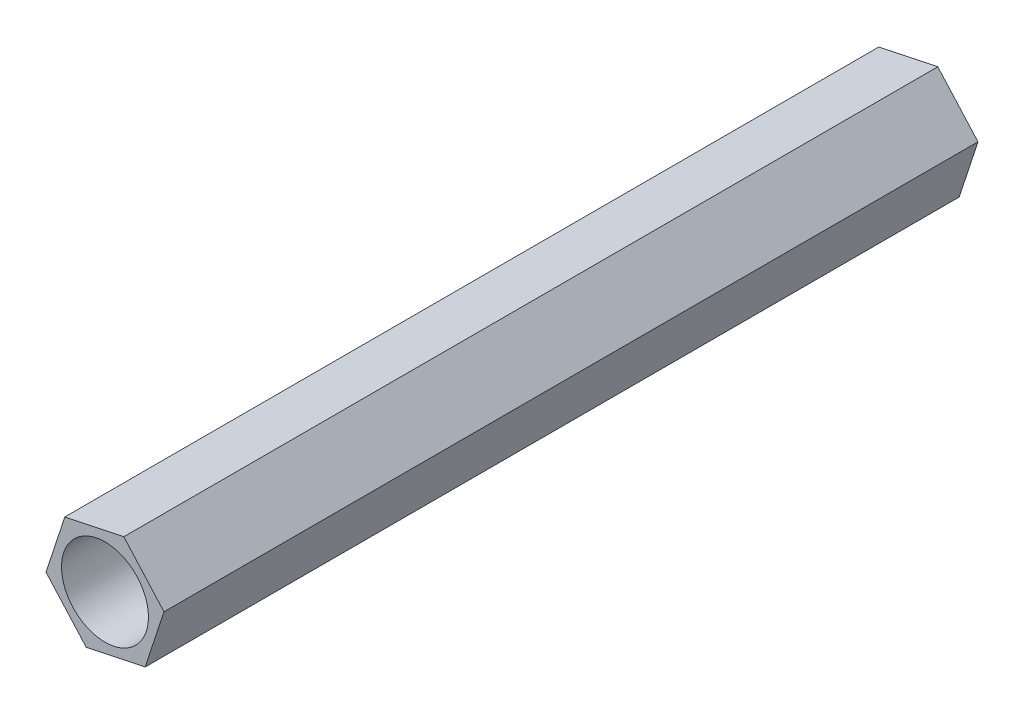
ISO-10303-21;
HEADER;
FILE_DESCRIPTION(('STEP AP214'),'2;1');
FILE_NAME('part.step','',(''),(''),'','','');
FILE_SCHEMA(('AUTOMOTIVE_DESIGN { 1 0 10303 214 1 1 1 1 }'));
ENDSEC;
DATA;
#1=APPLICATION_CONTEXT('core data for automotive mechanical design processes');
#2=APPLICATION_PROTOCOL_DEFINITION('international standard','automotive_design',2000,#1);
#3=PRODUCT_CONTEXT('',#1,'mechanical');
#4=PRODUCT('Part','Part','',(#3));
#5=PRODUCT_RELATED_PRODUCT_CATEGORY('part','',(#4));
#6=PRODUCT_DEFINITION_FORMATION('','',#4);
#7=PRODUCT_DEFINITION_CONTEXT('part definition',#1,'design');
#8=PRODUCT_DEFINITION('design','',#6,#7);
#9=PRODUCT_DEFINITION_SHAPE('','',#8);
#10=(LENGTH_UNIT() NAMED_UNIT(*) SI_UNIT(.MILLI.,.METRE.));
#11=(NAMED_UNIT(*) PLANE_ANGLE_UNIT() SI_UNIT($,.RADIAN.));
#12=(NAMED_UNIT(*) SI_UNIT($,.STERADIAN.) SOLID_ANGLE_UNIT());
#13=UNCERTAINTY_MEASURE_WITH_UNIT(LENGTH_MEASURE(1.E-05),#10,'distance_accuracy_value','');
#14=(GEOMETRIC_REPRESENTATION_CONTEXT(3) GLOBAL_UNCERTAINTY_ASSIGNED_CONTEXT((#13)) GLOBAL_UNIT_ASSIGNED_CONTEXT((#10,
#11,#12)) REPRESENTATION_CONTEXT('',''));
#15=CARTESIAN_POINT('',(0.,0.,0.));
#16=DIRECTION('',(0.,0.,1.));
#17=DIRECTION('',(1.,0.,0.));
#18=AXIS2_PLACEMENT_3D('',#15,#16,#17);
#19=CARTESIAN_POINT('',(2.30919726239614,-2.58217118010061,46.8));
#20=DIRECTION('',(-0.95000362208023,0.312238879761064,0.));
#21=DIRECTION('',(-0.312238879761064,-0.95000362208023,0.));
#22=AXIS2_PLACEMENT_3D('',#19,#20,#21);
#23=PLANE('',#22);
#24=DIRECTION('',(0.312238879761064,0.95000362208023,0.));
#25=VECTOR('',#24,1.);
#26=CARTESIAN_POINT('',(2.30919726239614,-2.58217118010061,0.));
#27=LINE('',#26,#25);
#28=CARTESIAN_POINT('',(2.30919726239614,-2.58217118010061,0.));
#29=VERTEX_POINT('',#28);
#30=CARTESIAN_POINT('',(3.39082447008525,0.708737901534229,0.));
#31=VERTEX_POINT('',#30);
#32=EDGE_CURVE('E118',#29,#31,#27,.T.);
#33=ORIENTED_EDGE('',*,*,#32,.T.);
#34=DIRECTION('',(0.,0.,-1.));
#35=VECTOR('',#34,1.);
#36=CARTESIAN_POINT('',(3.39082447008525,0.708737901534229,46.8));
#37=LINE('',#36,#35);
#38=CARTESIAN_POINT('',(3.39082447008525,0.708737901534229,46.8));
#39=VERTEX_POINT('',#38);
#40=EDGE_CURVE('E11',#39,#31,#37,.T.);
#41=ORIENTED_EDGE('',*,*,#40,.F.);
#42=DIRECTION('',(0.312238879761064,0.95000362208023,0.));
#43=VECTOR('',#42,1.);
#44=CARTESIAN_POINT('',(2.30919726239614,-2.58217118010061,46.8));
#45=LINE('',#44,#43);
#46=CARTESIAN_POINT('',(2.30919726239614,-2.58217118010061,46.8));
#47=VERTEX_POINT('',#46);
#48=EDGE_CURVE('E129',#47,#39,#45,.T.);
#49=ORIENTED_EDGE('',*,*,#48,.F.);
#50=DIRECTION('',(0.,0.,-1.));
#51=VECTOR('',#50,1.);
#52=CARTESIAN_POINT('',(2.30919726239614,-2.58217118010061,46.8));
#53=LINE('',#52,#51);
#54=EDGE_CURVE('E114',#47,#29,#53,.T.);
#55=ORIENTED_EDGE('',*,*,#54,.T.);
#56=EDGE_LOOP('',(#33,#41,#49,#55));
#57=FACE_BOUND('',#56,.T.);
#58=ADVANCED_FACE('F34',(#57),#23,.F.);
#59=CARTESIAN_POINT('',(3.39082447008525,0.708737901534229,46.8));
#60=DIRECTION('',(-0.745408612962391,-0.666607830528178,0.));
#61=DIRECTION('',(0.666607830528178,-0.745408612962391,0.));
#62=AXIS2_PLACEMENT_3D('',#59,#60,#61);
#63=PLANE('',#62);
#64=DIRECTION('',(-0.666607830528178,0.745408612962391,0.));
#65=VECTOR('',#64,1.);
#66=CARTESIAN_POINT('',(3.39082447008525,0.708737901534229,0.));
#67=LINE('',#66,#65);
#68=CARTESIAN_POINT('',(1.08162720768911,3.29090908163484,0.));
#69=VERTEX_POINT('',#68);
#70=EDGE_CURVE('E121',#31,#69,#67,.T.);
#71=ORIENTED_EDGE('',*,*,#70,.T.);
#72=DIRECTION('',(0.,0.,-1.));
#73=VECTOR('',#72,1.);
#74=CARTESIAN_POINT('',(1.08162720768911,3.29090908163484,46.8));
#75=LINE('',#74,#73);
#76=CARTESIAN_POINT('',(1.08162720768911,3.29090908163484,46.8));
#77=VERTEX_POINT('',#76);
#78=EDGE_CURVE('E42',#77,#69,#75,.T.);
#79=ORIENTED_EDGE('',*,*,#78,.F.);
#80=DIRECTION('',(-0.666607830528178,0.745408612962391,0.));
#81=VECTOR('',#80,1.);
#82=CARTESIAN_POINT('',(3.39082447008525,0.708737901534229,46.8));
#83=LINE('',#82,#81);
#84=EDGE_CURVE('E87',#39,#77,#83,.T.);
#85=ORIENTED_EDGE('',*,*,#84,.F.);
#86=ORIENTED_EDGE('',*,*,#40,.T.);
#87=EDGE_LOOP('',(#71,#79,#85,#86));
#88=FACE_BOUND('',#87,.T.);
#89=ADVANCED_FACE('F154',(#88),#63,.F.);
#90=CARTESIAN_POINT('',(1.08162720768911,3.29090908163484,46.8));
#91=DIRECTION('',(0.204595009117839,-0.978846710289242,0.));
#92=DIRECTION('',(0.978846710289242,0.204595009117839,0.));
#93=AXIS2_PLACEMENT_3D('',#90,#91,#92);
#94=PLANE('',#93);
#95=DIRECTION('',(-0.978846710289242,-0.204595009117839,0.));
#96=VECTOR('',#95,1.);
#97=CARTESIAN_POINT('',(1.08162720768911,3.29090908163484,0.));
#98=LINE('',#97,#96);
#99=CARTESIAN_POINT('',(-2.30919726239613,2.58217118010061,0.));
#100=VERTEX_POINT('',#99);
#101=EDGE_CURVE('E124',#69,#100,#98,.T.);
#102=ORIENTED_EDGE('',*,*,#101,.T.);
#103=DIRECTION('',(0.,0.,-1.));
#104=VECTOR('',#103,1.);
#105=CARTESIAN_POINT('',(-2.30919726239613,2.58217118010061,46.8));
#106=LINE('',#105,#104);
#107=CARTESIAN_POINT('',(-2.30919726239613,2.58217118010061,46.8));
#108=VERTEX_POINT('',#107);
#109=EDGE_CURVE('E109',#108,#100,#106,.T.);
#110=ORIENTED_EDGE('',*,*,#109,.F.);
#111=DIRECTION('',(-0.978846710289242,-0.204595009117839,0.));
#112=VECTOR('',#111,1.);
#113=CARTESIAN_POINT('',(1.08162720768911,3.29090908163484,46.8));
#114=LINE('',#113,#112);
#115=EDGE_CURVE('E100',#77,#108,#114,.T.);
#116=ORIENTED_EDGE('',*,*,#115,.F.);
#117=ORIENTED_EDGE('',*,*,#78,.T.);
#118=EDGE_LOOP('',(#102,#110,#116,#117));
#119=FACE_BOUND('',#118,.T.);
#120=ADVANCED_FACE('F135',(#119),#94,.F.);
#121=CARTESIAN_POINT('',(-2.30919726239613,2.58217118010061,46.8));
#122=DIRECTION('',(0.95000362208023,-0.312238879761064,0.));
#123=DIRECTION('',(0.312238879761064,0.95000362208023,0.));
#124=AXIS2_PLACEMENT_3D('',#121,#122,#123);
#125=PLANE('',#124);
#126=DIRECTION('',(-0.312238879761064,-0.95000362208023,0.));
#127=VECTOR('',#126,1.);
#128=CARTESIAN_POINT('',(-2.30919726239613,2.58217118010061,0.));
#129=LINE('',#128,#127);
#130=CARTESIAN_POINT('',(-3.39082447008524,-0.708737901534228,0.));
#131=VERTEX_POINT('',#130);
#132=EDGE_CURVE('E108',#100,#131,#129,.T.);
#133=ORIENTED_EDGE('',*,*,#132,.T.);
#134=DIRECTION('',(0.,0.,-1.));
#135=VECTOR('',#134,1.);
#136=CARTESIAN_POINT('',(-3.39082447008524,-0.708737901534228,46.8));
#137=LINE('',#136,#135);
#138=CARTESIAN_POINT('',(-3.39082447008524,-0.708737901534228,46.8));
#139=VERTEX_POINT('',#138);
#140=EDGE_CURVE('E105',#139,#131,#137,.T.);
#141=ORIENTED_EDGE('',*,*,#140,.F.);
#142=DIRECTION('',(-0.312238879761064,-0.95000362208023,0.));
#143=VECTOR('',#142,1.);
#144=CARTESIAN_POINT('',(-2.30919726239613,2.58217118010061,46.8));
#145=LINE('',#144,#143);
#146=EDGE_CURVE('E94',#108,#139,#145,.T.);
#147=ORIENTED_EDGE('',*,*,#146,.F.);
#148=ORIENTED_EDGE('',*,*,#109,.T.);
#149=EDGE_LOOP('',(#133,#141,#147,#148));
#150=FACE_BOUND('',#149,.T.);
#151=ADVANCED_FACE('F106',(#150),#125,.F.);
#152=CARTESIAN_POINT('',(-3.39082447008524,-0.708737901534228,46.8));
#153=DIRECTION('',(0.745408612962391,0.666607830528178,0.));
#154=DIRECTION('',(-0.666607830528179,0.745408612962391,0.));
#155=AXIS2_PLACEMENT_3D('',#152,#153,#154);
#156=PLANE('',#155);
#157=DIRECTION('',(0.666607830528179,-0.745408612962391,0.));
#158=VECTOR('',#157,1.);
#159=CARTESIAN_POINT('',(-3.39082447008524,-0.708737901534228,0.));
#160=LINE('',#159,#158);
#161=CARTESIAN_POINT('',(-1.0816272076891,-3.29090908163484,0.));
#162=VERTEX_POINT('',#161);
#163=EDGE_CURVE('E73',#131,#162,#160,.T.);
#164=ORIENTED_EDGE('',*,*,#163,.T.);
#165=DIRECTION('',(0.,0.,-1.));
#166=VECTOR('',#165,1.);
#167=CARTESIAN_POINT('',(-1.0816272076891,-3.29090908163484,46.8));
#168=LINE('',#167,#166);
#169=CARTESIAN_POINT('',(-1.0816272076891,-3.29090908163484,46.8));
#170=VERTEX_POINT('',#169);
#171=EDGE_CURVE('E110',#170,#162,#168,.T.);
#172=ORIENTED_EDGE('',*,*,#171,.F.);
#173=DIRECTION('',(0.666607830528179,-0.745408612962391,0.));
#174=VECTOR('',#173,1.);
#175=CARTESIAN_POINT('',(-3.39082447008524,-0.708737901534228,46.8));
#176=LINE('',#175,#174);
#177=EDGE_CURVE('E98',#139,#170,#176,.T.);
#178=ORIENTED_EDGE('',*,*,#177,.F.);
#179=ORIENTED_EDGE('',*,*,#140,.T.);
#180=EDGE_LOOP('',(#164,#172,#178,#179));
#181=FACE_BOUND('',#180,.T.);
#182=ADVANCED_FACE('F112',(#181),#156,.F.);
#183=CARTESIAN_POINT('',(-1.0816272076891,-3.29090908163484,46.8));
#184=DIRECTION('',(-0.204595009117839,0.978846710289242,0.));
#185=DIRECTION('',(-0.978846710289242,-0.204595009117839,0.));
#186=AXIS2_PLACEMENT_3D('',#183,#184,#185);
#187=PLANE('',#186);
#188=DIRECTION('',(0.978846710289242,0.204595009117839,0.));
#189=VECTOR('',#188,1.);
#190=CARTESIAN_POINT('',(-1.0816272076891,-3.29090908163484,0.));
#191=LINE('',#190,#189);
#192=EDGE_CURVE('E79',#162,#29,#191,.T.);
#193=ORIENTED_EDGE('',*,*,#192,.T.);
#194=ORIENTED_EDGE('',*,*,#54,.F.);
#195=DIRECTION('',(0.978846710289242,0.204595009117839,0.));
#196=VECTOR('',#195,1.);
#197=CARTESIAN_POINT('',(-1.0816272076891,-3.29090908163484,46.8));
#198=LINE('',#197,#196);
#199=EDGE_CURVE('E50',#170,#47,#198,.T.);
#200=ORIENTED_EDGE('',*,*,#199,.F.);
#201=ORIENTED_EDGE('',*,*,#171,.T.);
#202=EDGE_LOOP('',(#193,#194,#200,#201));
#203=FACE_BOUND('',#202,.T.);
#204=ADVANCED_FACE('F142',(#203),#187,.F.);
#205=CARTESIAN_POINT('',(0.,0.,46.8));
#206=DIRECTION('',(0.,0.,1.));
#207=DIRECTION('',(1.,0.,0.));
#208=AXIS2_PLACEMENT_3D('',#205,#206,#207);
#209=PLANE('',#208);
#210=CARTESIAN_POINT('',(0.,0.,46.8));
#211=DIRECTION('',(0.,0.,1.));
#212=DIRECTION('',(1.,0.,0.));
#213=AXIS2_PLACEMENT_3D('',#210,#211,#212);
#214=CIRCLE('',#213,2.5);
#215=CARTESIAN_POINT('',(2.5,0.,46.8));
#216=VERTEX_POINT('',#215);
#217=EDGE_CURVE('E237',#216,#216,#214,.T.);
#218=ORIENTED_EDGE('',*,*,#217,.F.);
#219=EDGE_LOOP('',(#218));
#220=FACE_BOUND('',#219,.T.);
#221=ORIENTED_EDGE('',*,*,#48,.T.);
#222=ORIENTED_EDGE('',*,*,#84,.T.);
#223=ORIENTED_EDGE('',*,*,#115,.T.);
#224=ORIENTED_EDGE('',*,*,#146,.T.);
#225=ORIENTED_EDGE('',*,*,#177,.T.);
#226=ORIENTED_EDGE('',*,*,#199,.T.);
#227=EDGE_LOOP('',(#221,#222,#223,#224,#225,#226));
#228=FACE_BOUND('',#227,.T.);
#229=ADVANCED_FACE('F96',(#220,#228),#209,.T.);
#230=CARTESIAN_POINT('',(0.,0.,0.));
#231=DIRECTION('',(0.,0.,1.));
#232=DIRECTION('',(1.,0.,0.));
#233=AXIS2_PLACEMENT_3D('',#230,#231,#232);
#234=PLANE('',#233);
#235=CARTESIAN_POINT('',(0.,0.,0.));
#236=DIRECTION('',(0.,0.,-1.));
#237=DIRECTION('',(-1.,0.,0.));
#238=AXIS2_PLACEMENT_3D('',#235,#236,#237);
#239=CIRCLE('',#238,2.5);
#240=CARTESIAN_POINT('',(-2.5,0.,0.));
#241=VERTEX_POINT('',#240);
#242=EDGE_CURVE('E238',#241,#241,#239,.T.);
#243=ORIENTED_EDGE('',*,*,#242,.F.);
#244=EDGE_LOOP('',(#243));
#245=FACE_BOUND('',#244,.T.);
#246=ORIENTED_EDGE('',*,*,#32,.F.);
#247=ORIENTED_EDGE('',*,*,#192,.F.);
#248=ORIENTED_EDGE('',*,*,#163,.F.);
#249=ORIENTED_EDGE('',*,*,#132,.F.);
#250=ORIENTED_EDGE('',*,*,#101,.F.);
#251=ORIENTED_EDGE('',*,*,#70,.F.);
#252=EDGE_LOOP('',(#246,#247,#248,#249,#250,#251));
#253=FACE_BOUND('',#252,.T.);
#254=ADVANCED_FACE('F138',(#245,#253),#234,.F.);
#255=CARTESIAN_POINT('',(0.,0.,31.8));
#256=DIRECTION('',(0.,0.,1.));
#257=DIRECTION('',(1.,0.,0.));
#258=AXIS2_PLACEMENT_3D('',#255,#256,#257);
#259=CYLINDRICAL_SURFACE('',#258,2.5);
#260=CARTESIAN_POINT('',(0.,0.,31.8));
#261=DIRECTION('',(0.,0.,1.));
#262=DIRECTION('',(1.,0.,0.));
#263=AXIS2_PLACEMENT_3D('',#260,#261,#262);
#264=CIRCLE('',#263,2.5);
#265=CARTESIAN_POINT('',(2.5,0.,31.8));
#266=VERTEX_POINT('',#265);
#267=EDGE_CURVE('E122',#266,#266,#264,.T.);
#268=ORIENTED_EDGE('',*,*,#267,.F.);
#269=EDGE_LOOP('',(#268));
#270=FACE_BOUND('',#269,.T.);
#271=ORIENTED_EDGE('',*,*,#217,.T.);
#272=EDGE_LOOP('',(#271));
#273=FACE_BOUND('',#272,.T.);
#274=ADVANCED_FACE('F189',(#270,#273),#259,.F.);
#275=CARTESIAN_POINT('',(0.,0.,31.8));
#276=DIRECTION('',(0.,0.,1.));
#277=DIRECTION('',(1.,0.,0.));
#278=AXIS2_PLACEMENT_3D('',#275,#276,#277);
#279=PLANE('',#278);
#280=ORIENTED_EDGE('',*,*,#267,.T.);
#281=EDGE_LOOP('',(#280));
#282=FACE_BOUND('',#281,.T.);
#283=ADVANCED_FACE('F194',(#282),#279,.T.);
#284=CARTESIAN_POINT('',(0.,0.,15.));
#285=DIRECTION('',(0.,0.,-1.));
#286=DIRECTION('',(-1.,0.,0.));
#287=AXIS2_PLACEMENT_3D('',#284,#285,#286);
#288=CYLINDRICAL_SURFACE('',#287,2.5);
#289=CARTESIAN_POINT('',(0.,0.,15.));
#290=DIRECTION('',(0.,0.,-1.));
#291=DIRECTION('',(-1.,0.,0.));
#292=AXIS2_PLACEMENT_3D('',#289,#290,#291);
#293=CIRCLE('',#292,2.5);
#294=CARTESIAN_POINT('',(-2.5,0.,15.));
#295=VERTEX_POINT('',#294);
#296=EDGE_CURVE('E236',#295,#295,#293,.T.);
#297=ORIENTED_EDGE('',*,*,#296,.F.);
#298=EDGE_LOOP('',(#297));
#299=FACE_BOUND('',#298,.T.);
#300=ORIENTED_EDGE('',*,*,#242,.T.);
#301=EDGE_LOOP('',(#300));
#302=FACE_BOUND('',#301,.T.);
#303=ADVANCED_FACE('F204',(#299,#302),#288,.F.);
#304=CARTESIAN_POINT('',(0.,0.,15.));
#305=DIRECTION('',(0.,0.,-1.));
#306=DIRECTION('',(-1.,0.,0.));
#307=AXIS2_PLACEMENT_3D('',#304,#305,#306);
#308=PLANE('',#307);
#309=ORIENTED_EDGE('',*,*,#296,.T.);
#310=EDGE_LOOP('',(#309));
#311=FACE_BOUND('',#310,.T.);
#312=ADVANCED_FACE('F220',(#311),#308,.T.);
#313=CLOSED_SHELL('',(#58,#89,#120,#151,#182,#204,#229,#254,#274,#283,#303,#312));
#314=MANIFOLD_SOLID_BREP('B2',#313);
#315=ADVANCED_BREP_SHAPE_REPRESENTATION('',(#18,#314),#14);
#316=SHAPE_DEFINITION_REPRESENTATION(#9,#315);
ENDSEC;
END-ISO-10303-21;
